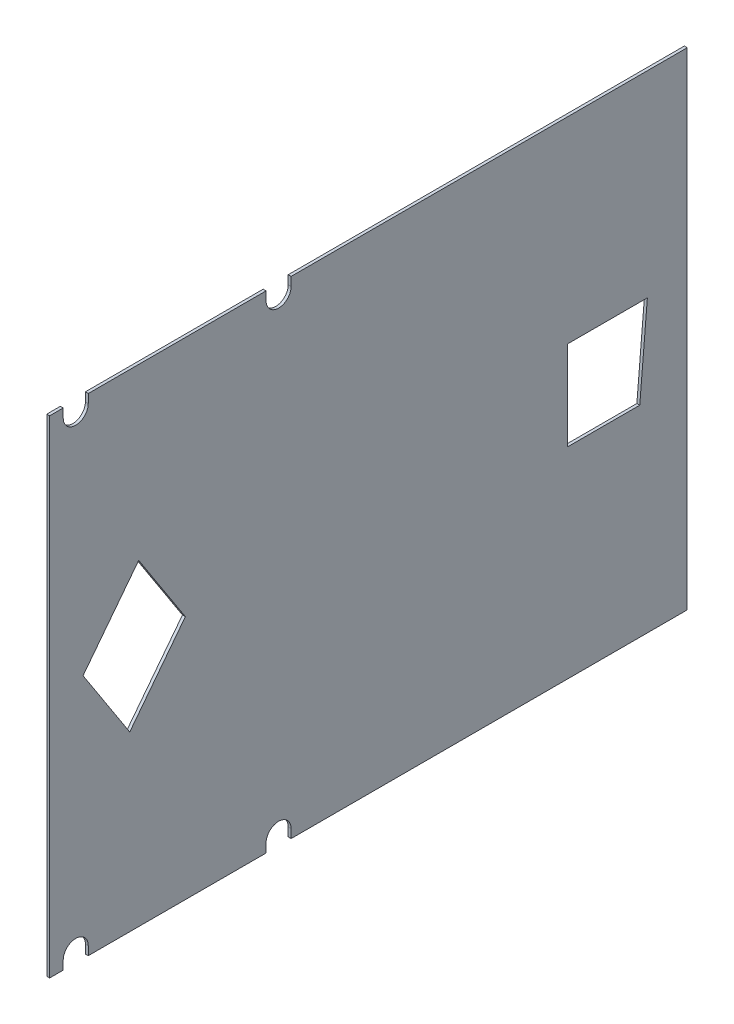
ISO-10303-21;
HEADER;
FILE_DESCRIPTION(('STEP AP214'),'2;1');
FILE_NAME('part.step','',(''),(''),'','','');
FILE_SCHEMA(('AUTOMOTIVE_DESIGN { 1 0 10303 214 1 1 1 1 }'));
ENDSEC;
DATA;
#1=APPLICATION_CONTEXT('core data for automotive mechanical design processes');
#2=APPLICATION_PROTOCOL_DEFINITION('international standard','automotive_design',2000,#1);
#3=PRODUCT_CONTEXT('',#1,'mechanical');
#4=PRODUCT('Part','Part','',(#3));
#5=PRODUCT_RELATED_PRODUCT_CATEGORY('part','',(#4));
#6=PRODUCT_DEFINITION_FORMATION('','',#4);
#7=PRODUCT_DEFINITION_CONTEXT('part definition',#1,'design');
#8=PRODUCT_DEFINITION('design','',#6,#7);
#9=PRODUCT_DEFINITION_SHAPE('','',#8);
#10=(LENGTH_UNIT() NAMED_UNIT(*) SI_UNIT(.MILLI.,.METRE.));
#11=(NAMED_UNIT(*) PLANE_ANGLE_UNIT() SI_UNIT($,.RADIAN.));
#12=(NAMED_UNIT(*) SI_UNIT($,.STERADIAN.) SOLID_ANGLE_UNIT());
#13=UNCERTAINTY_MEASURE_WITH_UNIT(LENGTH_MEASURE(1.E-05),#10,'distance_accuracy_value','');
#14=(GEOMETRIC_REPRESENTATION_CONTEXT(3) GLOBAL_UNCERTAINTY_ASSIGNED_CONTEXT((#13)) GLOBAL_UNIT_ASSIGNED_CONTEXT((#10,
#11,#12)) REPRESENTATION_CONTEXT('',''));
#15=CARTESIAN_POINT('',(0.,0.,0.));
#16=DIRECTION('',(0.,0.,1.));
#17=DIRECTION('',(1.,0.,0.));
#18=AXIS2_PLACEMENT_3D('',#15,#16,#17);
#19=CARTESIAN_POINT('',(537.21,0.,698.5));
#20=DIRECTION('',(1.,0.,0.));
#21=DIRECTION('',(0.,0.,-1.));
#22=AXIS2_PLACEMENT_3D('',#19,#20,#21);
#23=PLANE('',#22);
#24=DIRECTION('',(0.,0.791689200536526,-0.61092406218272));
#25=VECTOR('',#24,1.);
#26=CARTESIAN_POINT('',(537.210000000016,-343323.76724746,266035.64456976));
#27=LINE('',#26,#25);
#28=CARTESIAN_POINT('',(537.210000000012,-154.294651715804,1221.51287103187));
#29=VERTEX_POINT('',#28);
#30=CARTESIAN_POINT('',(537.210000000008,3.60928636956983,1099.66288841499));
#31=VERTEX_POINT('',#30);
#32=EDGE_CURVE('E400',#29,#31,#27,.T.);
#33=ORIENTED_EDGE('',*,*,#32,.T.);
#34=DIRECTION('',(0.,0.839231196070508,0.543774769129705));
#35=VECTOR('',#34,1.);
#36=CARTESIAN_POINT('',(537.210000000016,-323924.02816157,-208787.287325962));
#37=LINE('',#36,#35);
#38=CARTESIAN_POINT('',(537.210000000008,161.513224391404,1201.97578838665));
#39=VERTEX_POINT('',#38);
#40=EDGE_CURVE('E404',#31,#39,#37,.T.);
#41=ORIENTED_EDGE('',*,*,#40,.T.);
#42=DIRECTION('',(0.,0.791689200536087,-0.61092406218329));
#43=VECTOR('',#42,1.);
#44=CARTESIAN_POINT('',(537.210000000016,-343197.524019632,266162.389140502));
#45=LINE('',#44,#43);
#46=CARTESIAN_POINT('',(537.210000000008,3.60928629115551,1323.82577098407));
#47=VERTEX_POINT('',#46);
#48=EDGE_CURVE('E406',#47,#39,#45,.T.);
#49=ORIENTED_EDGE('',*,*,#48,.F.);
#50=DIRECTION('',(0.,0.839231196070312,0.543774769130008));
#51=VECTOR('',#50,1.);
#52=CARTESIAN_POINT('',(537.210000000016,-323929.564480698,-208566.711667876));
#53=LINE('',#52,#51);
#54=EDGE_CURVE('E388',#29,#47,#53,.T.);
#55=ORIENTED_EDGE('',*,*,#54,.F.);
#56=EDGE_LOOP('',(#33,#41,#49,#55));
#57=FACE_BOUND('',#56,.T.);
#58=DIRECTION('',(0.,-0.996382869390822,0.0849775122283019));
#59=VECTOR('',#58,1.);
#60=CARTESIAN_POINT('',(537.210000000016,159.214955997467,82.5312184746726));
#61=LINE('',#60,#59);
#62=CARTESIAN_POINT('',(537.210000000012,102.392130633223,87.3774101200606));
#63=VERTEX_POINT('',#62);
#64=CARTESIAN_POINT('',(537.210000000008,-92.9284400000066,104.035520861737));
#65=VERTEX_POINT('',#64);
#66=EDGE_CURVE('E416',#63,#65,#61,.T.);
#67=ORIENTED_EDGE('',*,*,#66,.F.);
#68=DIRECTION('',(0.,0.,-1.));
#69=VECTOR('',#68,1.);
#70=CARTESIAN_POINT('',(537.210000000016,102.392130633211,174.790387115402));
#71=LINE('',#70,#69);
#72=CARTESIAN_POINT('',(537.210000000012,102.39213063323,262.814315288784));
#73=VERTEX_POINT('',#72);
#74=EDGE_CURVE('E422',#73,#63,#71,.T.);
#75=ORIENTED_EDGE('',*,*,#74,.F.);
#76=DIRECTION('',(0.,1.,0.));
#77=VECTOR('',#76,1.);
#78=CARTESIAN_POINT('',(537.210000000016,-14.1484551013974,262.814315288784));
#79=LINE('',#78,#77);
#80=CARTESIAN_POINT('',(537.210000000008,-92.9284400000063,262.814315288784));
#81=VERTEX_POINT('',#80);
#82=EDGE_CURVE('E237',#73,#81,#79,.F.);
#83=ORIENTED_EDGE('',*,*,#82,.T.);
#84=DIRECTION('',(0.,0.,-1.));
#85=VECTOR('',#84,1.);
#86=CARTESIAN_POINT('',(537.210000000016,-92.9284400000254,187.057674076868));
#87=LINE('',#86,#85);
#88=EDGE_CURVE('E414',#81,#65,#87,.T.);
#89=ORIENTED_EDGE('',*,*,#88,.T.);
#90=EDGE_LOOP('',(#67,#75,#83,#89));
#91=FACE_BOUND('',#90,.T.);
#92=CARTESIAN_POINT('',(537.21,-514.35,1339.85));
#93=DIRECTION('',(1.,0.,0.));
#94=DIRECTION('',(0.,0.,-1.));
#95=AXIS2_PLACEMENT_3D('',#92,#93,#94);
#96=CIRCLE('',#95,27.432);
#97=CARTESIAN_POINT('',(537.21,-514.35,1312.418));
#98=VERTEX_POINT('',#97);
#99=CARTESIAN_POINT('',(537.21,-514.35,1367.282));
#100=VERTEX_POINT('',#99);
#101=EDGE_CURVE('E245',#98,#100,#96,.T.);
#102=ORIENTED_EDGE('',*,*,#101,.T.);
#103=DIRECTION('',(0.,1.,0.));
#104=VECTOR('',#103,1.);
#105=CARTESIAN_POINT('',(537.21,-524.502345270072,1367.282));
#106=LINE('',#105,#104);
#107=CARTESIAN_POINT('',(537.21,-533.4,1367.282));
#108=VERTEX_POINT('',#107);
#109=EDGE_CURVE('E242',#108,#100,#106,.T.);
#110=ORIENTED_EDGE('',*,*,#109,.F.);
#111=DIRECTION('',(0.,0.,-1.));
#112=VECTOR('',#111,1.);
#113=CARTESIAN_POINT('',(537.21,-533.4,417.48526692391));
#114=LINE('',#113,#112);
#115=CARTESIAN_POINT('',(537.21,-533.4,1397.));
#116=VERTEX_POINT('',#115);
#117=EDGE_CURVE('E249',#116,#108,#114,.T.);
#118=ORIENTED_EDGE('',*,*,#117,.F.);
#119=DIRECTION('',(0.,1.,0.));
#120=VECTOR('',#119,1.);
#121=CARTESIAN_POINT('',(537.21,-586.839999999898,1397.));
#122=LINE('',#121,#120);
#123=CARTESIAN_POINT('',(537.21,533.4,1397.));
#124=VERTEX_POINT('',#123);
#125=EDGE_CURVE('E254',#124,#116,#122,.F.);
#126=ORIENTED_EDGE('',*,*,#125,.F.);
#127=DIRECTION('',(0.,0.,-1.));
#128=VECTOR('',#127,1.);
#129=CARTESIAN_POINT('',(537.21,533.4,417.48526692391));
#130=LINE('',#129,#128);
#131=CARTESIAN_POINT('',(537.21,533.4,1367.282));
#132=VERTEX_POINT('',#131);
#133=EDGE_CURVE('E259',#124,#132,#130,.T.);
#134=ORIENTED_EDGE('',*,*,#133,.T.);
#135=DIRECTION('',(0.,1.,0.));
#136=VECTOR('',#135,1.);
#137=CARTESIAN_POINT('',(537.21,524.502345270072,1367.282));
#138=LINE('',#137,#136);
#139=CARTESIAN_POINT('',(537.21,514.35,1367.282));
#140=VERTEX_POINT('',#139);
#141=EDGE_CURVE('E265',#132,#140,#138,.F.);
#142=ORIENTED_EDGE('',*,*,#141,.T.);
#143=CARTESIAN_POINT('',(537.21,514.35,1339.85));
#144=DIRECTION('',(1.,0.,0.));
#145=DIRECTION('',(0.,0.,-1.));
#146=AXIS2_PLACEMENT_3D('',#143,#144,#145);
#147=CIRCLE('',#146,27.432);
#148=CARTESIAN_POINT('',(537.21,514.35,1312.418));
#149=VERTEX_POINT('',#148);
#150=EDGE_CURVE('E273',#140,#149,#147,.T.);
#151=ORIENTED_EDGE('',*,*,#150,.T.);
#152=DIRECTION('',(0.,1.,0.));
#153=VECTOR('',#152,1.);
#154=CARTESIAN_POINT('',(537.21,524.542945776374,1312.418));
#155=LINE('',#154,#153);
#156=CARTESIAN_POINT('',(537.21,533.4,1312.418));
#157=VERTEX_POINT('',#156);
#158=EDGE_CURVE('E270',#157,#149,#155,.F.);
#159=ORIENTED_EDGE('',*,*,#158,.F.);
#160=DIRECTION('',(0.,0.,-1.));
#161=VECTOR('',#160,1.);
#162=CARTESIAN_POINT('',(537.21,533.4,417.48526692391));
#163=LINE('',#162,#161);
#164=CARTESIAN_POINT('',(537.21,533.4,922.782));
#165=VERTEX_POINT('',#164);
#166=EDGE_CURVE('E277',#157,#165,#163,.T.);
#167=ORIENTED_EDGE('',*,*,#166,.T.);
#168=DIRECTION('',(0.,1.,0.));
#169=VECTOR('',#168,1.);
#170=CARTESIAN_POINT('',(537.21,528.24142642207,922.782));
#171=LINE('',#170,#169);
#172=CARTESIAN_POINT('',(537.21,514.35,922.782));
#173=VERTEX_POINT('',#172);
#174=EDGE_CURVE('E280',#173,#165,#171,.T.);
#175=ORIENTED_EDGE('',*,*,#174,.F.);
#176=CARTESIAN_POINT('',(537.21,514.35,895.35));
#177=DIRECTION('',(1.,0.,0.));
#178=DIRECTION('',(0.,0.,-1.));
#179=AXIS2_PLACEMENT_3D('',#176,#177,#178);
#180=CIRCLE('',#179,27.432);
#181=CARTESIAN_POINT('',(537.21,514.35,867.918));
#182=VERTEX_POINT('',#181);
#183=EDGE_CURVE('E291',#173,#182,#180,.T.);
#184=ORIENTED_EDGE('',*,*,#183,.T.);
#185=DIRECTION('',(0.,1.,0.));
#186=VECTOR('',#185,1.);
#187=CARTESIAN_POINT('',(537.21,528.72632228362,867.918));
#188=LINE('',#187,#186);
#189=CARTESIAN_POINT('',(537.21,533.4,867.918));
#190=VERTEX_POINT('',#189);
#191=EDGE_CURVE('E288',#190,#182,#188,.F.);
#192=ORIENTED_EDGE('',*,*,#191,.F.);
#193=DIRECTION('',(0.,0.,-1.));
#194=VECTOR('',#193,1.);
#195=CARTESIAN_POINT('',(537.21,533.4,417.48526692391));
#196=LINE('',#195,#194);
#197=CARTESIAN_POINT('',(537.21,533.4,0.));
#198=VERTEX_POINT('',#197);
#199=EDGE_CURVE('E295',#190,#198,#196,.T.);
#200=ORIENTED_EDGE('',*,*,#199,.T.);
#201=DIRECTION('',(0.,1.,0.));
#202=VECTOR('',#201,1.);
#203=CARTESIAN_POINT('',(537.21,20.8030939102161,0.));
#204=LINE('',#203,#202);
#205=CARTESIAN_POINT('',(537.21,-533.4,0.));
#206=VERTEX_POINT('',#205);
#207=EDGE_CURVE('E298',#206,#198,#204,.T.);
#208=ORIENTED_EDGE('',*,*,#207,.F.);
#209=DIRECTION('',(0.,0.,-1.));
#210=VECTOR('',#209,1.);
#211=CARTESIAN_POINT('',(537.21,-533.4,417.48526692391));
#212=LINE('',#211,#210);
#213=CARTESIAN_POINT('',(537.21,-533.4,867.918));
#214=VERTEX_POINT('',#213);
#215=EDGE_CURVE('E306',#214,#206,#212,.T.);
#216=ORIENTED_EDGE('',*,*,#215,.F.);
#217=DIRECTION('',(0.,1.,0.));
#218=VECTOR('',#217,1.);
#219=CARTESIAN_POINT('',(537.21,-528.72632228362,867.918));
#220=LINE('',#219,#218);
#221=CARTESIAN_POINT('',(537.21,-514.35,867.918));
#222=VERTEX_POINT('',#221);
#223=EDGE_CURVE('E198',#214,#222,#220,.T.);
#224=ORIENTED_EDGE('',*,*,#223,.T.);
#225=CARTESIAN_POINT('',(537.21,-514.35,895.35));
#226=DIRECTION('',(1.,0.,0.));
#227=DIRECTION('',(0.,0.,-1.));
#228=AXIS2_PLACEMENT_3D('',#225,#226,#227);
#229=CIRCLE('',#228,27.432);
#230=CARTESIAN_POINT('',(537.21,-514.35,922.782));
#231=VERTEX_POINT('',#230);
#232=EDGE_CURVE('E19',#222,#231,#229,.T.);
#233=ORIENTED_EDGE('',*,*,#232,.T.);
#234=DIRECTION('',(0.,1.,0.));
#235=VECTOR('',#234,1.);
#236=CARTESIAN_POINT('',(537.21,-528.24142642207,922.782));
#237=LINE('',#236,#235);
#238=CARTESIAN_POINT('',(537.21,-533.4,922.782));
#239=VERTEX_POINT('',#238);
#240=EDGE_CURVE('E202',#231,#239,#237,.F.);
#241=ORIENTED_EDGE('',*,*,#240,.T.);
#242=DIRECTION('',(0.,0.,-1.));
#243=VECTOR('',#242,1.);
#244=CARTESIAN_POINT('',(537.21,-533.4,417.48526692391));
#245=LINE('',#244,#243);
#246=CARTESIAN_POINT('',(537.21,-533.4,1312.418));
#247=VERTEX_POINT('',#246);
#248=EDGE_CURVE('E235',#247,#239,#245,.T.);
#249=ORIENTED_EDGE('',*,*,#248,.F.);
#250=DIRECTION('',(0.,1.,0.));
#251=VECTOR('',#250,1.);
#252=CARTESIAN_POINT('',(537.21,-524.542945776374,1312.418));
#253=LINE('',#252,#251);
#254=EDGE_CURVE('E230',#247,#98,#253,.T.);
#255=ORIENTED_EDGE('',*,*,#254,.T.);
#256=EDGE_LOOP('',(#102,#110,#118,#126,#134,#142,#151,#159,#167,#175,#184,#192,#200,#208,#216,
#224,#233,#241,#249,#255));
#257=FACE_BOUND('',#256,.T.);
#258=ADVANCED_FACE('F16',(#57,#91,#257),#23,.F.);
#259=CARTESIAN_POINT('',(543.56,-528.24142642207,922.782));
#260=DIRECTION('',(0.,0.,1.));
#261=DIRECTION('',(1.,0.,0.));
#262=AXIS2_PLACEMENT_3D('',#259,#260,#261);
#263=PLANE('',#262);
#264=DIRECTION('',(0.,1.,0.));
#265=VECTOR('',#264,1.);
#266=CARTESIAN_POINT('',(543.56,0.,922.782));
#267=LINE('',#266,#265);
#268=CARTESIAN_POINT('',(543.56,-533.4,922.782));
#269=VERTEX_POINT('',#268);
#270=CARTESIAN_POINT('',(543.56,-514.35,922.782));
#271=VERTEX_POINT('',#270);
#272=EDGE_CURVE('E330',#269,#271,#267,.T.);
#273=ORIENTED_EDGE('',*,*,#272,.F.);
#274=DIRECTION('',(1.,0.,0.));
#275=VECTOR('',#274,1.);
#276=CARTESIAN_POINT('',(543.56,-533.4,922.782));
#277=LINE('',#276,#275);
#278=EDGE_CURVE('E212',#239,#269,#277,.T.);
#279=ORIENTED_EDGE('',*,*,#278,.F.);
#280=ORIENTED_EDGE('',*,*,#240,.F.);
#281=DIRECTION('',(1.,0.,0.));
#282=VECTOR('',#281,1.);
#283=CARTESIAN_POINT('',(543.56,-514.35,922.782));
#284=LINE('',#283,#282);
#285=EDGE_CURVE('E207',#231,#271,#284,.T.);
#286=ORIENTED_EDGE('',*,*,#285,.T.);
#287=EDGE_LOOP('',(#273,#279,#280,#286));
#288=FACE_BOUND('',#287,.T.);
#289=ADVANCED_FACE('F209',(#288),#263,.F.);
#290=CARTESIAN_POINT('',(543.56,-514.35,895.35));
#291=DIRECTION('',(1.,0.,0.));
#292=DIRECTION('',(0.,0.,-1.));
#293=AXIS2_PLACEMENT_3D('',#290,#291,#292);
#294=CYLINDRICAL_SURFACE('',#293,27.432);
#295=CARTESIAN_POINT('',(543.56,-514.35,895.35));
#296=DIRECTION('',(1.,0.,0.));
#297=DIRECTION('',(0.,0.,-1.));
#298=AXIS2_PLACEMENT_3D('',#295,#296,#297);
#299=CIRCLE('',#298,27.432);
#300=CARTESIAN_POINT('',(543.56,-514.35,867.918));
#301=VERTEX_POINT('',#300);
#302=EDGE_CURVE('E217',#271,#301,#299,.F.);
#303=ORIENTED_EDGE('',*,*,#302,.F.);
#304=ORIENTED_EDGE('',*,*,#285,.F.);
#305=ORIENTED_EDGE('',*,*,#232,.F.);
#306=DIRECTION('',(-1.,0.,0.));
#307=VECTOR('',#306,1.);
#308=CARTESIAN_POINT('',(543.56,-514.35,867.918));
#309=LINE('',#308,#307);
#310=EDGE_CURVE('E220',#222,#301,#309,.F.);
#311=ORIENTED_EDGE('',*,*,#310,.T.);
#312=EDGE_LOOP('',(#303,#304,#305,#311));
#313=FACE_BOUND('',#312,.T.);
#314=ADVANCED_FACE('F215',(#313),#294,.F.);
#315=CARTESIAN_POINT('',(543.56,-528.72632228362,867.918));
#316=DIRECTION('',(0.,0.,-1.));
#317=DIRECTION('',(-1.,0.,0.));
#318=AXIS2_PLACEMENT_3D('',#315,#316,#317);
#319=PLANE('',#318);
#320=DIRECTION('',(0.,1.,0.));
#321=VECTOR('',#320,1.);
#322=CARTESIAN_POINT('',(543.56,0.,867.918));
#323=LINE('',#322,#321);
#324=CARTESIAN_POINT('',(543.56,-533.4,867.918));
#325=VERTEX_POINT('',#324);
#326=EDGE_CURVE('E329',#301,#325,#323,.F.);
#327=ORIENTED_EDGE('',*,*,#326,.F.);
#328=ORIENTED_EDGE('',*,*,#310,.F.);
#329=ORIENTED_EDGE('',*,*,#223,.F.);
#330=DIRECTION('',(1.,0.,0.));
#331=VECTOR('',#330,1.);
#332=CARTESIAN_POINT('',(543.56,-533.4,867.918));
#333=LINE('',#332,#331);
#334=EDGE_CURVE('E308',#325,#214,#333,.F.);
#335=ORIENTED_EDGE('',*,*,#334,.F.);
#336=EDGE_LOOP('',(#327,#328,#329,#335));
#337=FACE_BOUND('',#336,.T.);
#338=ADVANCED_FACE('F377',(#337),#319,.F.);
#339=CARTESIAN_POINT('',(543.56,-533.4,417.48526692391));
#340=DIRECTION('',(0.,-1.,0.));
#341=DIRECTION('',(0.,0.,-1.));
#342=AXIS2_PLACEMENT_3D('',#339,#340,#341);
#343=PLANE('',#342);
#344=ORIENTED_EDGE('',*,*,#334,.T.);
#345=ORIENTED_EDGE('',*,*,#215,.T.);
#346=DIRECTION('',(-1.,0.,0.));
#347=VECTOR('',#346,1.);
#348=CARTESIAN_POINT('',(543.56,-533.4,0.));
#349=LINE('',#348,#347);
#350=CARTESIAN_POINT('',(543.56,-533.4,0.));
#351=VERTEX_POINT('',#350);
#352=EDGE_CURVE('E303',#351,#206,#349,.T.);
#353=ORIENTED_EDGE('',*,*,#352,.F.);
#354=DIRECTION('',(0.,0.,-1.));
#355=VECTOR('',#354,1.);
#356=CARTESIAN_POINT('',(543.56,-533.4,698.5));
#357=LINE('',#356,#355);
#358=EDGE_CURVE('E359',#325,#351,#357,.T.);
#359=ORIENTED_EDGE('',*,*,#358,.F.);
#360=EDGE_LOOP('',(#344,#345,#353,#359));
#361=FACE_BOUND('',#360,.T.);
#362=ADVANCED_FACE('F509',(#361),#343,.T.);
#363=CARTESIAN_POINT('',(543.56,20.8030939102161,0.));
#364=DIRECTION('',(0.,0.,-1.));
#365=DIRECTION('',(-1.,0.,0.));
#366=AXIS2_PLACEMENT_3D('',#363,#364,#365);
#367=PLANE('',#366);
#368=ORIENTED_EDGE('',*,*,#352,.T.);
#369=ORIENTED_EDGE('',*,*,#207,.T.);
#370=DIRECTION('',(1.,0.,0.));
#371=VECTOR('',#370,1.);
#372=CARTESIAN_POINT('',(543.56,533.4,0.));
#373=LINE('',#372,#371);
#374=CARTESIAN_POINT('',(543.56,533.4,0.));
#375=VERTEX_POINT('',#374);
#376=EDGE_CURVE('E297',#198,#375,#373,.T.);
#377=ORIENTED_EDGE('',*,*,#376,.T.);
#378=DIRECTION('',(0.,1.,0.));
#379=VECTOR('',#378,1.);
#380=CARTESIAN_POINT('',(543.56,0.,0.));
#381=LINE('',#380,#379);
#382=EDGE_CURVE('E351',#351,#375,#381,.T.);
#383=ORIENTED_EDGE('',*,*,#382,.F.);
#384=EDGE_LOOP('',(#368,#369,#377,#383));
#385=FACE_BOUND('',#384,.T.);
#386=ADVANCED_FACE('F507',(#385),#367,.T.);
#387=CARTESIAN_POINT('',(543.56,533.4,417.48526692391));
#388=DIRECTION('',(0.,-1.,0.));
#389=DIRECTION('',(0.,0.,-1.));
#390=AXIS2_PLACEMENT_3D('',#387,#388,#389);
#391=PLANE('',#390);
#392=DIRECTION('',(0.,0.,-1.));
#393=VECTOR('',#392,1.);
#394=CARTESIAN_POINT('',(543.56,533.4,698.5));
#395=LINE('',#394,#393);
#396=CARTESIAN_POINT('',(543.56,533.4,867.918));
#397=VERTEX_POINT('',#396);
#398=EDGE_CURVE('E348',#375,#397,#395,.F.);
#399=ORIENTED_EDGE('',*,*,#398,.F.);
#400=ORIENTED_EDGE('',*,*,#376,.F.);
#401=ORIENTED_EDGE('',*,*,#199,.F.);
#402=DIRECTION('',(1.,0.,0.));
#403=VECTOR('',#402,1.);
#404=CARTESIAN_POINT('',(543.56,533.4,867.918));
#405=LINE('',#404,#403);
#406=EDGE_CURVE('E292',#397,#190,#405,.F.);
#407=ORIENTED_EDGE('',*,*,#406,.F.);
#408=EDGE_LOOP('',(#399,#400,#401,#407));
#409=FACE_BOUND('',#408,.T.);
#410=ADVANCED_FACE('F503',(#409),#391,.F.);
#411=CARTESIAN_POINT('',(543.56,528.72632228362,867.918));
#412=DIRECTION('',(0.,0.,1.));
#413=DIRECTION('',(1.,0.,0.));
#414=AXIS2_PLACEMENT_3D('',#411,#412,#413);
#415=PLANE('',#414);
#416=ORIENTED_EDGE('',*,*,#406,.T.);
#417=ORIENTED_EDGE('',*,*,#191,.T.);
#418=DIRECTION('',(1.,0.,0.));
#419=VECTOR('',#418,1.);
#420=CARTESIAN_POINT('',(543.56,514.35,867.918));
#421=LINE('',#420,#419);
#422=CARTESIAN_POINT('',(543.56,514.35,867.918));
#423=VERTEX_POINT('',#422);
#424=EDGE_CURVE('E332',#182,#423,#421,.T.);
#425=ORIENTED_EDGE('',*,*,#424,.T.);
#426=DIRECTION('',(0.,1.,0.));
#427=VECTOR('',#426,1.);
#428=CARTESIAN_POINT('',(543.56,0.,867.918));
#429=LINE('',#428,#427);
#430=EDGE_CURVE('E327',#397,#423,#429,.F.);
#431=ORIENTED_EDGE('',*,*,#430,.F.);
#432=EDGE_LOOP('',(#416,#417,#425,#431));
#433=FACE_BOUND('',#432,.T.);
#434=ADVANCED_FACE('F501',(#433),#415,.T.);
#435=CARTESIAN_POINT('',(543.56,514.35,895.35));
#436=DIRECTION('',(1.,0.,0.));
#437=DIRECTION('',(0.,0.,-1.));
#438=AXIS2_PLACEMENT_3D('',#435,#436,#437);
#439=CYLINDRICAL_SURFACE('',#438,27.432);
#440=CARTESIAN_POINT('',(543.56,514.35,895.35));
#441=DIRECTION('',(1.,0.,0.));
#442=DIRECTION('',(0.,0.,-1.));
#443=AXIS2_PLACEMENT_3D('',#440,#441,#442);
#444=CIRCLE('',#443,27.432);
#445=CARTESIAN_POINT('',(543.56,514.35,922.782));
#446=VERTEX_POINT('',#445);
#447=EDGE_CURVE('E323',#423,#446,#444,.F.);
#448=ORIENTED_EDGE('',*,*,#447,.F.);
#449=ORIENTED_EDGE('',*,*,#424,.F.);
#450=ORIENTED_EDGE('',*,*,#183,.F.);
#451=DIRECTION('',(-1.,0.,0.));
#452=VECTOR('',#451,1.);
#453=CARTESIAN_POINT('',(543.56,514.35,922.782));
#454=LINE('',#453,#452);
#455=EDGE_CURVE('E285',#446,#173,#454,.T.);
#456=ORIENTED_EDGE('',*,*,#455,.F.);
#457=EDGE_LOOP('',(#448,#449,#450,#456));
#458=FACE_BOUND('',#457,.T.);
#459=ADVANCED_FACE('F602',(#458),#439,.F.);
#460=CARTESIAN_POINT('',(543.56,528.24142642207,922.782));
#461=DIRECTION('',(0.,0.,-1.));
#462=DIRECTION('',(-1.,0.,0.));
#463=AXIS2_PLACEMENT_3D('',#460,#461,#462);
#464=PLANE('',#463);
#465=ORIENTED_EDGE('',*,*,#455,.T.);
#466=ORIENTED_EDGE('',*,*,#174,.T.);
#467=DIRECTION('',(1.,0.,0.));
#468=VECTOR('',#467,1.);
#469=CARTESIAN_POINT('',(543.56,533.4,922.782));
#470=LINE('',#469,#468);
#471=CARTESIAN_POINT('',(543.56,533.4,922.782));
#472=VERTEX_POINT('',#471);
#473=EDGE_CURVE('E279',#165,#472,#470,.T.);
#474=ORIENTED_EDGE('',*,*,#473,.T.);
#475=DIRECTION('',(0.,1.,0.));
#476=VECTOR('',#475,1.);
#477=CARTESIAN_POINT('',(543.56,0.,922.782));
#478=LINE('',#477,#476);
#479=EDGE_CURVE('E326',#446,#472,#478,.T.);
#480=ORIENTED_EDGE('',*,*,#479,.F.);
#481=EDGE_LOOP('',(#465,#466,#474,#480));
#482=FACE_BOUND('',#481,.T.);
#483=ADVANCED_FACE('F484',(#482),#464,.T.);
#484=CARTESIAN_POINT('',(543.56,533.4,417.48526692391));
#485=DIRECTION('',(0.,-1.,0.));
#486=DIRECTION('',(0.,0.,-1.));
#487=AXIS2_PLACEMENT_3D('',#484,#485,#486);
#488=PLANE('',#487);
#489=DIRECTION('',(0.,0.,-1.));
#490=VECTOR('',#489,1.);
#491=CARTESIAN_POINT('',(543.56,533.4,698.5));
#492=LINE('',#491,#490);
#493=CARTESIAN_POINT('',(543.56,533.4,1312.418));
#494=VERTEX_POINT('',#493);
#495=EDGE_CURVE('E474',#472,#494,#492,.F.);
#496=ORIENTED_EDGE('',*,*,#495,.F.);
#497=ORIENTED_EDGE('',*,*,#473,.F.);
#498=ORIENTED_EDGE('',*,*,#166,.F.);
#499=DIRECTION('',(1.,0.,0.));
#500=VECTOR('',#499,1.);
#501=CARTESIAN_POINT('',(543.56,533.4,1312.418));
#502=LINE('',#501,#500);
#503=EDGE_CURVE('E274',#494,#157,#502,.F.);
#504=ORIENTED_EDGE('',*,*,#503,.F.);
#505=EDGE_LOOP('',(#496,#497,#498,#504));
#506=FACE_BOUND('',#505,.T.);
#507=ADVANCED_FACE('F487',(#506),#488,.F.);
#508=CARTESIAN_POINT('',(543.56,524.542945776374,1312.418));
#509=DIRECTION('',(0.,0.,1.));
#510=DIRECTION('',(1.,0.,0.));
#511=AXIS2_PLACEMENT_3D('',#508,#509,#510);
#512=PLANE('',#511);
#513=ORIENTED_EDGE('',*,*,#503,.T.);
#514=ORIENTED_EDGE('',*,*,#158,.T.);
#515=DIRECTION('',(1.,0.,0.));
#516=VECTOR('',#515,1.);
#517=CARTESIAN_POINT('',(543.56,514.35,1312.418));
#518=LINE('',#517,#516);
#519=CARTESIAN_POINT('',(543.56,514.35,1312.418));
#520=VERTEX_POINT('',#519);
#521=EDGE_CURVE('E267',#149,#520,#518,.T.);
#522=ORIENTED_EDGE('',*,*,#521,.T.);
#523=DIRECTION('',(0.,1.,0.));
#524=VECTOR('',#523,1.);
#525=CARTESIAN_POINT('',(543.56,0.,1312.418));
#526=LINE('',#525,#524);
#527=EDGE_CURVE('E322',#494,#520,#526,.F.);
#528=ORIENTED_EDGE('',*,*,#527,.F.);
#529=EDGE_LOOP('',(#513,#514,#522,#528));
#530=FACE_BOUND('',#529,.T.);
#531=ADVANCED_FACE('F593',(#530),#512,.T.);
#532=CARTESIAN_POINT('',(543.56,514.35,1339.85));
#533=DIRECTION('',(1.,0.,0.));
#534=DIRECTION('',(0.,0.,-1.));
#535=AXIS2_PLACEMENT_3D('',#532,#533,#534);
#536=CYLINDRICAL_SURFACE('',#535,27.432);
#537=CARTESIAN_POINT('',(543.56,514.35,1339.85));
#538=DIRECTION('',(1.,0.,0.));
#539=DIRECTION('',(0.,0.,-1.));
#540=AXIS2_PLACEMENT_3D('',#537,#538,#539);
#541=CIRCLE('',#540,27.432);
#542=CARTESIAN_POINT('',(543.56,514.35,1367.282));
#543=VERTEX_POINT('',#542);
#544=EDGE_CURVE('E318',#520,#543,#541,.F.);
#545=ORIENTED_EDGE('',*,*,#544,.F.);
#546=ORIENTED_EDGE('',*,*,#521,.F.);
#547=ORIENTED_EDGE('',*,*,#150,.F.);
#548=DIRECTION('',(1.,0.,0.));
#549=VECTOR('',#548,1.);
#550=CARTESIAN_POINT('',(543.56,514.35,1367.282));
#551=LINE('',#550,#549);
#552=EDGE_CURVE('E262',#140,#543,#551,.T.);
#553=ORIENTED_EDGE('',*,*,#552,.T.);
#554=EDGE_LOOP('',(#545,#546,#547,#553));
#555=FACE_BOUND('',#554,.T.);
#556=ADVANCED_FACE('F589',(#555),#536,.F.);
#557=CARTESIAN_POINT('',(543.56,524.502345270072,1367.282));
#558=DIRECTION('',(0.,0.,1.));
#559=DIRECTION('',(1.,0.,0.));
#560=AXIS2_PLACEMENT_3D('',#557,#558,#559);
#561=PLANE('',#560);
#562=DIRECTION('',(0.,1.,0.));
#563=VECTOR('',#562,1.);
#564=CARTESIAN_POINT('',(543.56,0.,1367.282));
#565=LINE('',#564,#563);
#566=CARTESIAN_POINT('',(543.56,533.4,1367.282));
#567=VERTEX_POINT('',#566);
#568=EDGE_CURVE('E321',#543,#567,#565,.T.);
#569=ORIENTED_EDGE('',*,*,#568,.F.);
#570=ORIENTED_EDGE('',*,*,#552,.F.);
#571=ORIENTED_EDGE('',*,*,#141,.F.);
#572=DIRECTION('',(1.,0.,0.));
#573=VECTOR('',#572,1.);
#574=CARTESIAN_POINT('',(543.56,533.4,1367.282));
#575=LINE('',#574,#573);
#576=EDGE_CURVE('E261',#132,#567,#575,.T.);
#577=ORIENTED_EDGE('',*,*,#576,.T.);
#578=EDGE_LOOP('',(#569,#570,#571,#577));
#579=FACE_BOUND('',#578,.T.);
#580=ADVANCED_FACE('F585',(#579),#561,.F.);
#581=CARTESIAN_POINT('',(543.56,533.4,417.48526692391));
#582=DIRECTION('',(0.,-1.,0.));
#583=DIRECTION('',(0.,0.,-1.));
#584=AXIS2_PLACEMENT_3D('',#581,#582,#583);
#585=PLANE('',#584);
#586=DIRECTION('',(0.,0.,-1.));
#587=VECTOR('',#586,1.);
#588=CARTESIAN_POINT('',(543.56,533.4,698.5));
#589=LINE('',#588,#587);
#590=CARTESIAN_POINT('',(543.56,533.4,1397.));
#591=VERTEX_POINT('',#590);
#592=EDGE_CURVE('E454',#567,#591,#589,.F.);
#593=ORIENTED_EDGE('',*,*,#592,.F.);
#594=ORIENTED_EDGE('',*,*,#576,.F.);
#595=ORIENTED_EDGE('',*,*,#133,.F.);
#596=DIRECTION('',(1.,0.,0.));
#597=VECTOR('',#596,1.);
#598=CARTESIAN_POINT('',(543.56,533.4,1397.));
#599=LINE('',#598,#597);
#600=EDGE_CURVE('E256',#591,#124,#599,.F.);
#601=ORIENTED_EDGE('',*,*,#600,.F.);
#602=EDGE_LOOP('',(#593,#594,#595,#601));
#603=FACE_BOUND('',#602,.T.);
#604=ADVANCED_FACE('F581',(#603),#585,.F.);
#605=CARTESIAN_POINT('',(543.56,-586.839999999898,1397.));
#606=DIRECTION('',(0.,0.,1.));
#607=DIRECTION('',(1.,0.,0.));
#608=AXIS2_PLACEMENT_3D('',#605,#606,#607);
#609=PLANE('',#608);
#610=ORIENTED_EDGE('',*,*,#600,.T.);
#611=ORIENTED_EDGE('',*,*,#125,.T.);
#612=DIRECTION('',(1.,0.,0.));
#613=VECTOR('',#612,1.);
#614=CARTESIAN_POINT('',(543.56,-533.4,1397.));
#615=LINE('',#614,#613);
#616=CARTESIAN_POINT('',(543.56,-533.4,1397.));
#617=VERTEX_POINT('',#616);
#618=EDGE_CURVE('E251',#617,#116,#615,.F.);
#619=ORIENTED_EDGE('',*,*,#618,.F.);
#620=DIRECTION('',(0.,1.,0.));
#621=VECTOR('',#620,1.);
#622=CARTESIAN_POINT('',(543.56,0.,1397.));
#623=LINE('',#622,#621);
#624=EDGE_CURVE('E445',#591,#617,#623,.F.);
#625=ORIENTED_EDGE('',*,*,#624,.F.);
#626=EDGE_LOOP('',(#610,#611,#619,#625));
#627=FACE_BOUND('',#626,.T.);
#628=ADVANCED_FACE('F577',(#627),#609,.T.);
#629=CARTESIAN_POINT('',(543.56,-533.4,417.48526692391));
#630=DIRECTION('',(0.,-1.,0.));
#631=DIRECTION('',(0.,0.,-1.));
#632=AXIS2_PLACEMENT_3D('',#629,#630,#631);
#633=PLANE('',#632);
#634=ORIENTED_EDGE('',*,*,#618,.T.);
#635=ORIENTED_EDGE('',*,*,#117,.T.);
#636=DIRECTION('',(-1.,0.,0.));
#637=VECTOR('',#636,1.);
#638=CARTESIAN_POINT('',(543.56,-533.4,1367.282));
#639=LINE('',#638,#637);
#640=CARTESIAN_POINT('',(543.56,-533.4,1367.282));
#641=VERTEX_POINT('',#640);
#642=EDGE_CURVE('E246',#641,#108,#639,.T.);
#643=ORIENTED_EDGE('',*,*,#642,.F.);
#644=DIRECTION('',(0.,0.,-1.));
#645=VECTOR('',#644,1.);
#646=CARTESIAN_POINT('',(543.56,-533.4,698.5));
#647=LINE('',#646,#645);
#648=EDGE_CURVE('E442',#617,#641,#647,.T.);
#649=ORIENTED_EDGE('',*,*,#648,.F.);
#650=EDGE_LOOP('',(#634,#635,#643,#649));
#651=FACE_BOUND('',#650,.T.);
#652=ADVANCED_FACE('F573',(#651),#633,.T.);
#653=CARTESIAN_POINT('',(543.56,-524.502345270072,1367.282));
#654=DIRECTION('',(0.,0.,-1.));
#655=DIRECTION('',(-1.,0.,0.));
#656=AXIS2_PLACEMENT_3D('',#653,#654,#655);
#657=PLANE('',#656);
#658=ORIENTED_EDGE('',*,*,#642,.T.);
#659=ORIENTED_EDGE('',*,*,#109,.T.);
#660=DIRECTION('',(1.,0.,0.));
#661=VECTOR('',#660,1.);
#662=CARTESIAN_POINT('',(543.56,-514.35,1367.282));
#663=LINE('',#662,#661);
#664=CARTESIAN_POINT('',(543.56,-514.35,1367.282));
#665=VERTEX_POINT('',#664);
#666=EDGE_CURVE('E232',#100,#665,#663,.T.);
#667=ORIENTED_EDGE('',*,*,#666,.T.);
#668=DIRECTION('',(0.,1.,0.));
#669=VECTOR('',#668,1.);
#670=CARTESIAN_POINT('',(543.56,0.,1367.282));
#671=LINE('',#670,#669);
#672=EDGE_CURVE('E317',#641,#665,#671,.T.);
#673=ORIENTED_EDGE('',*,*,#672,.F.);
#674=EDGE_LOOP('',(#658,#659,#667,#673));
#675=FACE_BOUND('',#674,.T.);
#676=ADVANCED_FACE('F569',(#675),#657,.T.);
#677=CARTESIAN_POINT('',(543.56,-514.35,1339.85));
#678=DIRECTION('',(1.,0.,0.));
#679=DIRECTION('',(0.,0.,-1.));
#680=AXIS2_PLACEMENT_3D('',#677,#678,#679);
#681=CYLINDRICAL_SURFACE('',#680,27.432);
#682=CARTESIAN_POINT('',(543.56,-514.35,1339.85));
#683=DIRECTION('',(1.,0.,0.));
#684=DIRECTION('',(0.,0.,-1.));
#685=AXIS2_PLACEMENT_3D('',#682,#683,#684);
#686=CIRCLE('',#685,27.432);
#687=CARTESIAN_POINT('',(543.56,-514.35,1312.418));
#688=VERTEX_POINT('',#687);
#689=EDGE_CURVE('E313',#665,#688,#686,.F.);
#690=ORIENTED_EDGE('',*,*,#689,.F.);
#691=ORIENTED_EDGE('',*,*,#666,.F.);
#692=ORIENTED_EDGE('',*,*,#101,.F.);
#693=DIRECTION('',(-1.,0.,0.));
#694=VECTOR('',#693,1.);
#695=CARTESIAN_POINT('',(543.56,-514.35,1312.418));
#696=LINE('',#695,#694);
#697=EDGE_CURVE('E227',#98,#688,#696,.F.);
#698=ORIENTED_EDGE('',*,*,#697,.T.);
#699=EDGE_LOOP('',(#690,#691,#692,#698));
#700=FACE_BOUND('',#699,.T.);
#701=ADVANCED_FACE('F565',(#700),#681,.F.);
#702=CARTESIAN_POINT('',(543.56,-524.542945776374,1312.418));
#703=DIRECTION('',(0.,0.,-1.));
#704=DIRECTION('',(-1.,0.,0.));
#705=AXIS2_PLACEMENT_3D('',#702,#703,#704);
#706=PLANE('',#705);
#707=DIRECTION('',(0.,1.,0.));
#708=VECTOR('',#707,1.);
#709=CARTESIAN_POINT('',(543.56,0.,1312.418));
#710=LINE('',#709,#708);
#711=CARTESIAN_POINT('',(543.56,-533.4,1312.418));
#712=VERTEX_POINT('',#711);
#713=EDGE_CURVE('E316',#688,#712,#710,.F.);
#714=ORIENTED_EDGE('',*,*,#713,.F.);
#715=ORIENTED_EDGE('',*,*,#697,.F.);
#716=ORIENTED_EDGE('',*,*,#254,.F.);
#717=DIRECTION('',(1.,0.,0.));
#718=VECTOR('',#717,1.);
#719=CARTESIAN_POINT('',(543.56,-533.4,1312.418));
#720=LINE('',#719,#718);
#721=EDGE_CURVE('E226',#712,#247,#720,.F.);
#722=ORIENTED_EDGE('',*,*,#721,.F.);
#723=EDGE_LOOP('',(#714,#715,#716,#722));
#724=FACE_BOUND('',#723,.T.);
#725=ADVANCED_FACE('F561',(#724),#706,.F.);
#726=CARTESIAN_POINT('',(543.56,-533.4,417.48526692391));
#727=DIRECTION('',(0.,-1.,0.));
#728=DIRECTION('',(0.,0.,-1.));
#729=AXIS2_PLACEMENT_3D('',#726,#727,#728);
#730=PLANE('',#729);
#731=ORIENTED_EDGE('',*,*,#721,.T.);
#732=ORIENTED_EDGE('',*,*,#248,.T.);
#733=ORIENTED_EDGE('',*,*,#278,.T.);
#734=DIRECTION('',(0.,0.,-1.));
#735=VECTOR('',#734,1.);
#736=CARTESIAN_POINT('',(543.56,-533.4,698.5));
#737=LINE('',#736,#735);
#738=EDGE_CURVE('E384',#712,#269,#737,.T.);
#739=ORIENTED_EDGE('',*,*,#738,.F.);
#740=EDGE_LOOP('',(#731,#732,#733,#739));
#741=FACE_BOUND('',#740,.T.);
#742=ADVANCED_FACE('F557',(#741),#730,.T.);
#743=CARTESIAN_POINT('',(-500000.000000032,-14.1484551013974,262.814315288784));
#744=DIRECTION('',(0.,0.,1.));
#745=DIRECTION('',(1.,0.,0.));
#746=AXIS2_PLACEMENT_3D('',#743,#744,#745);
#747=PLANE('',#746);
#748=DIRECTION('',(0.,1.,0.));
#749=VECTOR('',#748,1.);
#750=CARTESIAN_POINT('',(543.56,0.,262.814315288784));
#751=LINE('',#750,#749);
#752=CARTESIAN_POINT('',(543.56000000001,-92.9284400000063,262.814315288784));
#753=VERTEX_POINT('',#752);
#754=CARTESIAN_POINT('',(543.56000000001,102.39213063323,262.814315288784));
#755=VERTEX_POINT('',#754);
#756=EDGE_CURVE('E430',#753,#755,#751,.T.);
#757=ORIENTED_EDGE('',*,*,#756,.F.);
#758=DIRECTION('',(1.,0.,0.));
#759=VECTOR('',#758,1.);
#760=CARTESIAN_POINT('',(-500000.000000032,-92.9284400000254,262.814315288784));
#761=LINE('',#760,#759);
#762=EDGE_CURVE('E409',#753,#81,#761,.F.);
#763=ORIENTED_EDGE('',*,*,#762,.T.);
#764=ORIENTED_EDGE('',*,*,#82,.F.);
#765=DIRECTION('',(1.,0.,0.));
#766=VECTOR('',#765,1.);
#767=CARTESIAN_POINT('',(-500000.000000032,102.392130633211,262.814315288784));
#768=LINE('',#767,#766);
#769=EDGE_CURVE('E424',#755,#73,#768,.F.);
#770=ORIENTED_EDGE('',*,*,#769,.F.);
#771=EDGE_LOOP('',(#757,#763,#764,#770));
#772=FACE_BOUND('',#771,.T.);
#773=ADVANCED_FACE('F553',(#772),#747,.F.);
#774=CARTESIAN_POINT('',(-500000.000000032,102.392130633211,174.790387115402));
#775=DIRECTION('',(0.,-1.,0.));
#776=DIRECTION('',(0.,0.,-1.));
#777=AXIS2_PLACEMENT_3D('',#774,#775,#776);
#778=PLANE('',#777);
#779=ORIENTED_EDGE('',*,*,#74,.T.);
#780=DIRECTION('',(1.,0.,0.));
#781=VECTOR('',#780,1.);
#782=CARTESIAN_POINT('',(-500000.000000032,102.392130633235,87.3774101200468));
#783=LINE('',#782,#781);
#784=CARTESIAN_POINT('',(543.56000000001,102.392130633223,87.3774101200606));
#785=VERTEX_POINT('',#784);
#786=EDGE_CURVE('E419',#785,#63,#783,.F.);
#787=ORIENTED_EDGE('',*,*,#786,.F.);
#788=DIRECTION('',(0.,0.,-1.));
#789=VECTOR('',#788,1.);
#790=CARTESIAN_POINT('',(543.56,102.392130633236,698.5));
#791=LINE('',#790,#789);
#792=EDGE_CURVE('E809',#755,#785,#791,.T.);
#793=ORIENTED_EDGE('',*,*,#792,.F.);
#794=ORIENTED_EDGE('',*,*,#769,.T.);
#795=EDGE_LOOP('',(#779,#787,#793,#794));
#796=FACE_BOUND('',#795,.T.);
#797=ADVANCED_FACE('F549',(#796),#778,.T.);
#798=CARTESIAN_POINT('',(-500000.000000032,159.214955997467,82.5312184746726));
#799=DIRECTION('',(0.,0.0849775122283019,0.996382869390822));
#800=DIRECTION('',(0.,-0.996382869390822,0.0849775122283019));
#801=AXIS2_PLACEMENT_3D('',#798,#799,#800);
#802=PLANE('',#801);
#803=ORIENTED_EDGE('',*,*,#66,.T.);
#804=DIRECTION('',(1.,0.,0.));
#805=VECTOR('',#804,1.);
#806=CARTESIAN_POINT('',(-500000.000000032,-92.9284400000254,104.03552086174));
#807=LINE('',#806,#805);
#808=CARTESIAN_POINT('',(543.56000000001,-92.9284400000069,104.035520861739));
#809=VERTEX_POINT('',#808);
#810=EDGE_CURVE('E412',#65,#809,#807,.T.);
#811=ORIENTED_EDGE('',*,*,#810,.T.);
#812=DIRECTION('',(0.,-0.996382869390814,0.0849775122284066));
#813=VECTOR('',#812,1.);
#814=CARTESIAN_POINT('',(543.56,102.392130633236,87.3774101200652));
#815=LINE('',#814,#813);
#816=EDGE_CURVE('E806',#785,#809,#815,.T.);
#817=ORIENTED_EDGE('',*,*,#816,.F.);
#818=ORIENTED_EDGE('',*,*,#786,.T.);
#819=EDGE_LOOP('',(#803,#811,#817,#818));
#820=FACE_BOUND('',#819,.T.);
#821=ADVANCED_FACE('F545',(#820),#802,.T.);
#822=CARTESIAN_POINT('',(-500000.000000032,-92.9284400000254,187.057674076868));
#823=DIRECTION('',(0.,-1.,0.));
#824=DIRECTION('',(0.,0.,-1.));
#825=AXIS2_PLACEMENT_3D('',#822,#823,#824);
#826=PLANE('',#825);
#827=DIRECTION('',(0.,0.,-1.));
#828=VECTOR('',#827,1.);
#829=CARTESIAN_POINT('',(543.56,-92.92844,698.5));
#830=LINE('',#829,#828);
#831=EDGE_CURVE('E814',#809,#753,#830,.F.);
#832=ORIENTED_EDGE('',*,*,#831,.F.);
#833=ORIENTED_EDGE('',*,*,#810,.F.);
#834=ORIENTED_EDGE('',*,*,#88,.F.);
#835=ORIENTED_EDGE('',*,*,#762,.F.);
#836=EDGE_LOOP('',(#832,#833,#834,#835));
#837=FACE_BOUND('',#836,.T.);
#838=ADVANCED_FACE('F541',(#837),#826,.F.);
#839=CARTESIAN_POINT('',(-500000.000000032,-343197.524019632,266162.389140502));
#840=DIRECTION('',(0.,-0.61092406218329,-0.791689200536087));
#841=DIRECTION('',(0.,0.791689200536087,-0.61092406218329));
#842=AXIS2_PLACEMENT_3D('',#839,#840,#841);
#843=PLANE('',#842);
#844=ORIENTED_EDGE('',*,*,#48,.T.);
#845=DIRECTION('',(1.,0.,0.));
#846=VECTOR('',#845,1.);
#847=CARTESIAN_POINT('',(-500000.000000032,161.513224391115,1201.97578839529));
#848=LINE('',#847,#846);
#849=CARTESIAN_POINT('',(543.56000000001,161.513224388516,1201.97578838288));
#850=VERTEX_POINT('',#849);
#851=EDGE_CURVE('E402',#39,#850,#848,.T.);
#852=ORIENTED_EDGE('',*,*,#851,.T.);
#853=DIRECTION('',(0.,0.791689200514167,-0.610924062211695));
#854=VECTOR('',#853,1.);
#855=CARTESIAN_POINT('',(543.56,3.60928630199208,1323.82577097867));
#856=LINE('',#855,#854);
#857=CARTESIAN_POINT('',(543.56000000001,3.60928628717554,1323.82577097887));
#858=VERTEX_POINT('',#857);
#859=EDGE_CURVE('E815',#858,#850,#856,.T.);
#860=ORIENTED_EDGE('',*,*,#859,.F.);
#861=DIRECTION('',(1.,0.,0.));
#862=VECTOR('',#861,1.);
#863=CARTESIAN_POINT('',(-500000.000000032,3.60928627452495,1323.82577102109));
#864=LINE('',#863,#862);
#865=EDGE_CURVE('E385',#47,#858,#864,.T.);
#866=ORIENTED_EDGE('',*,*,#865,.F.);
#867=EDGE_LOOP('',(#844,#852,#860,#866));
#868=FACE_BOUND('',#867,.T.);
#869=ADVANCED_FACE('F537',(#868),#843,.T.);
#870=CARTESIAN_POINT('',(-500000.000000032,-323924.02816157,-208787.287325962));
#871=DIRECTION('',(0.,0.543774769129705,-0.839231196070508));
#872=DIRECTION('',(0.,0.839231196070508,0.543774769129705));
#873=AXIS2_PLACEMENT_3D('',#870,#871,#872);
#874=PLANE('',#873);
#875=DIRECTION('',(0.,-0.839231196130072,-0.543774769037778));
#876=VECTOR('',#875,1.);
#877=CARTESIAN_POINT('',(543.56,161.513224395384,1201.9757883888));
#878=LINE('',#877,#876);
#879=CARTESIAN_POINT('',(543.56000000001,3.60928637134525,1099.6628884123));
#880=VERTEX_POINT('',#879);
#881=EDGE_CURVE('E854',#850,#880,#878,.T.);
#882=ORIENTED_EDGE('',*,*,#881,.F.);
#883=ORIENTED_EDGE('',*,*,#851,.F.);
#884=ORIENTED_EDGE('',*,*,#40,.F.);
#885=DIRECTION('',(1.,0.,0.));
#886=VECTOR('',#885,1.);
#887=CARTESIAN_POINT('',(-500000.000000032,3.60928641623559,1099.66288848045));
#888=LINE('',#887,#886);
#889=EDGE_CURVE('E398',#31,#880,#888,.T.);
#890=ORIENTED_EDGE('',*,*,#889,.T.);
#891=EDGE_LOOP('',(#882,#883,#884,#890));
#892=FACE_BOUND('',#891,.T.);
#893=ADVANCED_FACE('F534',(#892),#874,.F.);
#894=CARTESIAN_POINT('',(-500000.000000032,-343323.76724746,266035.64456976));
#895=DIRECTION('',(0.,-0.61092406218272,-0.791689200536526));
#896=DIRECTION('',(0.,0.791689200536526,-0.61092406218272));
#897=AXIS2_PLACEMENT_3D('',#894,#895,#896);
#898=PLANE('',#897);
#899=DIRECTION('',(0.,-0.791689200514327,0.610924062211487));
#900=VECTOR('',#899,1.);
#901=CARTESIAN_POINT('',(543.56,3.60928635172528,1099.66288839677));
#902=LINE('',#901,#900);
#903=CARTESIAN_POINT('',(543.56000000001,-154.294651715791,1221.51287103187));
#904=VERTEX_POINT('',#903);
#905=EDGE_CURVE('E25',#880,#904,#902,.T.);
#906=ORIENTED_EDGE('',*,*,#905,.F.);
#907=ORIENTED_EDGE('',*,*,#889,.F.);
#908=ORIENTED_EDGE('',*,*,#32,.F.);
#909=DIRECTION('',(1.,0.,0.));
#910=VECTOR('',#909,1.);
#911=CARTESIAN_POINT('',(-500000.000000032,-154.294651757994,1221.51287101164));
#912=LINE('',#911,#910);
#913=EDGE_CURVE('E34',#904,#29,#912,.F.);
#914=ORIENTED_EDGE('',*,*,#913,.F.);
#915=EDGE_LOOP('',(#906,#907,#908,#914));
#916=FACE_BOUND('',#915,.T.);
#917=ADVANCED_FACE('F526',(#916),#898,.F.);
#918=CARTESIAN_POINT('',(-500000.000000032,-323929.564480698,-208566.711667876));
#919=DIRECTION('',(0.,0.543774769130008,-0.839231196070312));
#920=DIRECTION('',(0.,0.839231196070312,0.543774769130008));
#921=AXIS2_PLACEMENT_3D('',#918,#919,#920);
#922=PLANE('',#921);
#923=ORIENTED_EDGE('',*,*,#54,.T.);
#924=ORIENTED_EDGE('',*,*,#865,.T.);
#925=DIRECTION('',(0.,0.839231196130209,0.543774769037567));
#926=VECTOR('',#925,1.);
#927=CARTESIAN_POINT('',(543.56,-154.294651741753,1221.51287098664));
#928=LINE('',#927,#926);
#929=EDGE_CURVE('E11',#904,#858,#928,.T.);
#930=ORIENTED_EDGE('',*,*,#929,.F.);
#931=ORIENTED_EDGE('',*,*,#913,.T.);
#932=EDGE_LOOP('',(#923,#924,#930,#931));
#933=FACE_BOUND('',#932,.T.);
#934=ADVANCED_FACE('F520',(#933),#922,.T.);
#935=CARTESIAN_POINT('',(543.56,0.,698.5));
#936=DIRECTION('',(1.,0.,0.));
#937=DIRECTION('',(0.,0.,-1.));
#938=AXIS2_PLACEMENT_3D('',#935,#936,#937);
#939=PLANE('',#938);
#940=ORIENTED_EDGE('',*,*,#905,.T.);
#941=ORIENTED_EDGE('',*,*,#929,.T.);
#942=ORIENTED_EDGE('',*,*,#859,.T.);
#943=ORIENTED_EDGE('',*,*,#881,.T.);
#944=EDGE_LOOP('',(#940,#941,#942,#943));
#945=FACE_BOUND('',#944,.T.);
#946=ORIENTED_EDGE('',*,*,#816,.T.);
#947=ORIENTED_EDGE('',*,*,#831,.T.);
#948=ORIENTED_EDGE('',*,*,#756,.T.);
#949=ORIENTED_EDGE('',*,*,#792,.T.);
#950=EDGE_LOOP('',(#946,#947,#948,#949));
#951=FACE_BOUND('',#950,.T.);
#952=ORIENTED_EDGE('',*,*,#713,.T.);
#953=ORIENTED_EDGE('',*,*,#738,.T.);
#954=ORIENTED_EDGE('',*,*,#272,.T.);
#955=ORIENTED_EDGE('',*,*,#302,.T.);
#956=ORIENTED_EDGE('',*,*,#326,.T.);
#957=ORIENTED_EDGE('',*,*,#358,.T.);
#958=ORIENTED_EDGE('',*,*,#382,.T.);
#959=ORIENTED_EDGE('',*,*,#398,.T.);
#960=ORIENTED_EDGE('',*,*,#430,.T.);
#961=ORIENTED_EDGE('',*,*,#447,.T.);
#962=ORIENTED_EDGE('',*,*,#479,.T.);
#963=ORIENTED_EDGE('',*,*,#495,.T.);
#964=ORIENTED_EDGE('',*,*,#527,.T.);
#965=ORIENTED_EDGE('',*,*,#544,.T.);
#966=ORIENTED_EDGE('',*,*,#568,.T.);
#967=ORIENTED_EDGE('',*,*,#592,.T.);
#968=ORIENTED_EDGE('',*,*,#624,.T.);
#969=ORIENTED_EDGE('',*,*,#648,.T.);
#970=ORIENTED_EDGE('',*,*,#672,.T.);
#971=ORIENTED_EDGE('',*,*,#689,.T.);
#972=EDGE_LOOP('',(#952,#953,#954,#955,#956,#957,#958,#959,#960,#961,#962,#963,#964,#965,#966,
#967,#968,#969,#970,#971));
#973=FACE_BOUND('',#972,.T.);
#974=ADVANCED_FACE('F381',(#945,#951,#973),#939,.T.);
#975=CLOSED_SHELL('',(#258,#289,#314,#338,#362,#386,#410,#434,#459,#483,#507,#531,#556,#580,
#604,#628,#652,#676,#701,#725,#742,#773,#797,#821,#838,#869,#893,#917,#934,#974));
#976=MANIFOLD_SOLID_BREP('B1',#975);
#977=ADVANCED_BREP_SHAPE_REPRESENTATION('',(#18,#976),#14);
#978=SHAPE_DEFINITION_REPRESENTATION(#9,#977);
ENDSEC;
END-ISO-10303-21;
